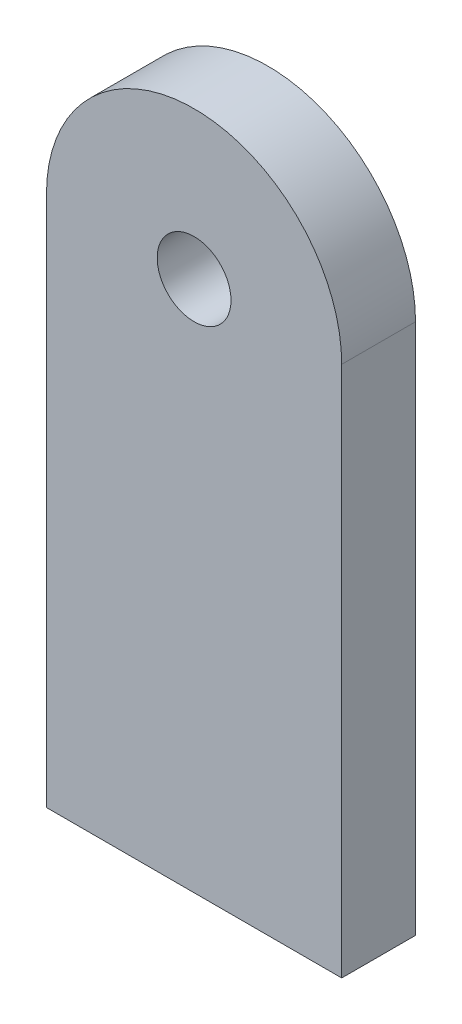
ISO-10303-21;
HEADER;
FILE_DESCRIPTION(('STEP AP214'),'2;1');
FILE_NAME('part.step','',(''),(''),'','','');
FILE_SCHEMA(('AUTOMOTIVE_DESIGN { 1 0 10303 214 1 1 1 1 }'));
ENDSEC;
DATA;
#1=APPLICATION_CONTEXT('core data for automotive mechanical design processes');
#2=APPLICATION_PROTOCOL_DEFINITION('international standard','automotive_design',2000,#1);
#3=PRODUCT_CONTEXT('',#1,'mechanical');
#4=PRODUCT('Part','Part','',(#3));
#5=PRODUCT_RELATED_PRODUCT_CATEGORY('part','',(#4));
#6=PRODUCT_DEFINITION_FORMATION('','',#4);
#7=PRODUCT_DEFINITION_CONTEXT('part definition',#1,'design');
#8=PRODUCT_DEFINITION('design','',#6,#7);
#9=PRODUCT_DEFINITION_SHAPE('','',#8);
#10=(LENGTH_UNIT() NAMED_UNIT(*) SI_UNIT(.MILLI.,.METRE.));
#11=(NAMED_UNIT(*) PLANE_ANGLE_UNIT() SI_UNIT($,.RADIAN.));
#12=(NAMED_UNIT(*) SI_UNIT($,.STERADIAN.) SOLID_ANGLE_UNIT());
#13=UNCERTAINTY_MEASURE_WITH_UNIT(LENGTH_MEASURE(1.E-05),#10,'distance_accuracy_value','');
#14=(GEOMETRIC_REPRESENTATION_CONTEXT(3) GLOBAL_UNCERTAINTY_ASSIGNED_CONTEXT((#13)) GLOBAL_UNIT_ASSIGNED_CONTEXT((#10,
#11,#12)) REPRESENTATION_CONTEXT('',''));
#15=CARTESIAN_POINT('',(0.,0.,0.));
#16=DIRECTION('',(0.,0.,1.));
#17=DIRECTION('',(1.,0.,0.));
#18=AXIS2_PLACEMENT_3D('',#15,#16,#17);
#19=CARTESIAN_POINT('',(50.,180.,25.));
#20=DIRECTION('',(0.,0.,-1.));
#21=DIRECTION('',(-1.,0.,0.));
#22=AXIS2_PLACEMENT_3D('',#19,#20,#21);
#23=PLANE('',#22);
#24=DIRECTION('',(0.,-1.,0.));
#25=VECTOR('',#24,1.);
#26=CARTESIAN_POINT('',(0.,180.,25.));
#27=LINE('',#26,#25);
#28=CARTESIAN_POINT('',(0.,180.,25.));
#29=VERTEX_POINT('',#28);
#30=CARTESIAN_POINT('',(0.,0.,25.));
#31=VERTEX_POINT('',#30);
#32=EDGE_CURVE('E88',#29,#31,#27,.T.);
#33=ORIENTED_EDGE('',*,*,#32,.T.);
#34=DIRECTION('',(1.,0.,0.));
#35=VECTOR('',#34,1.);
#36=CARTESIAN_POINT('',(0.,0.,25.));
#37=LINE('',#36,#35);
#38=CARTESIAN_POINT('',(100.,0.,25.));
#39=VERTEX_POINT('',#38);
#40=EDGE_CURVE('E83',#31,#39,#37,.T.);
#41=ORIENTED_EDGE('',*,*,#40,.T.);
#42=DIRECTION('',(0.,1.,0.));
#43=VECTOR('',#42,1.);
#44=CARTESIAN_POINT('',(100.,0.,25.));
#45=LINE('',#44,#43);
#46=CARTESIAN_POINT('',(100.,180.,25.));
#47=VERTEX_POINT('',#46);
#48=EDGE_CURVE('E86',#39,#47,#45,.T.);
#49=ORIENTED_EDGE('',*,*,#48,.T.);
#50=CARTESIAN_POINT('',(50.,180.,25.));
#51=DIRECTION('',(0.,0.,1.));
#52=DIRECTION('',(-1.,0.,0.));
#53=AXIS2_PLACEMENT_3D('',#50,#51,#52);
#54=CIRCLE('',#53,50.);
#55=EDGE_CURVE('E53',#47,#29,#54,.T.);
#56=ORIENTED_EDGE('',*,*,#55,.T.);
#57=EDGE_LOOP('',(#33,#41,#49,#56));
#58=FACE_BOUND('',#57,.T.);
#59=CARTESIAN_POINT('',(50.,180.,25.));
#60=DIRECTION('',(0.,0.,1.));
#61=DIRECTION('',(1.,0.,0.));
#62=AXIS2_PLACEMENT_3D('',#59,#60,#61);
#63=CIRCLE('',#62,12.5);
#64=CARTESIAN_POINT('',(62.5,180.,25.));
#65=VERTEX_POINT('',#64);
#66=EDGE_CURVE('E103',#65,#65,#63,.T.);
#67=ORIENTED_EDGE('',*,*,#66,.F.);
#68=EDGE_LOOP('',(#67));
#69=FACE_BOUND('',#68,.T.);
#70=ADVANCED_FACE('F36',(#58,#69),#23,.F.);
#71=CARTESIAN_POINT('',(50.,180.,0.));
#72=DIRECTION('',(0.,0.,-1.));
#73=DIRECTION('',(-1.,0.,0.));
#74=AXIS2_PLACEMENT_3D('',#71,#72,#73);
#75=PLANE('',#74);
#76=DIRECTION('',(0.,-1.,0.));
#77=VECTOR('',#76,1.);
#78=CARTESIAN_POINT('',(0.,180.,0.));
#79=LINE('',#78,#77);
#80=CARTESIAN_POINT('',(0.,180.,0.));
#81=VERTEX_POINT('',#80);
#82=CARTESIAN_POINT('',(0.,0.,0.));
#83=VERTEX_POINT('',#82);
#84=EDGE_CURVE('E100',#81,#83,#79,.T.);
#85=ORIENTED_EDGE('',*,*,#84,.F.);
#86=CARTESIAN_POINT('',(50.,180.,0.));
#87=DIRECTION('',(0.,0.,1.));
#88=DIRECTION('',(-1.,0.,0.));
#89=AXIS2_PLACEMENT_3D('',#86,#87,#88);
#90=CIRCLE('',#89,50.);
#91=CARTESIAN_POINT('',(100.,180.,0.));
#92=VERTEX_POINT('',#91);
#93=EDGE_CURVE('E76',#92,#81,#90,.T.);
#94=ORIENTED_EDGE('',*,*,#93,.F.);
#95=DIRECTION('',(0.,1.,0.));
#96=VECTOR('',#95,1.);
#97=CARTESIAN_POINT('',(100.,0.,0.));
#98=LINE('',#97,#96);
#99=CARTESIAN_POINT('',(100.,0.,0.));
#100=VERTEX_POINT('',#99);
#101=EDGE_CURVE('E70',#100,#92,#98,.T.);
#102=ORIENTED_EDGE('',*,*,#101,.F.);
#103=DIRECTION('',(1.,0.,0.));
#104=VECTOR('',#103,1.);
#105=CARTESIAN_POINT('',(0.,0.,0.));
#106=LINE('',#105,#104);
#107=EDGE_CURVE('E92',#83,#100,#106,.T.);
#108=ORIENTED_EDGE('',*,*,#107,.F.);
#109=EDGE_LOOP('',(#85,#94,#102,#108));
#110=FACE_BOUND('',#109,.T.);
#111=CARTESIAN_POINT('',(50.,180.,0.));
#112=DIRECTION('',(0.,0.,1.));
#113=DIRECTION('',(1.,0.,0.));
#114=AXIS2_PLACEMENT_3D('',#111,#112,#113);
#115=CIRCLE('',#114,12.5);
#116=CARTESIAN_POINT('',(62.5,180.,0.));
#117=VERTEX_POINT('',#116);
#118=EDGE_CURVE('E115',#117,#117,#115,.T.);
#119=ORIENTED_EDGE('',*,*,#118,.T.);
#120=EDGE_LOOP('',(#119));
#121=FACE_BOUND('',#120,.T.);
#122=ADVANCED_FACE('F111',(#110,#121),#75,.T.);
#123=CARTESIAN_POINT('',(0.,180.,25.));
#124=DIRECTION('',(1.,0.,0.));
#125=DIRECTION('',(0.,1.,0.));
#126=AXIS2_PLACEMENT_3D('',#123,#124,#125);
#127=PLANE('',#126);
#128=ORIENTED_EDGE('',*,*,#84,.T.);
#129=DIRECTION('',(0.,0.,-1.));
#130=VECTOR('',#129,1.);
#131=CARTESIAN_POINT('',(0.,0.,25.));
#132=LINE('',#131,#130);
#133=EDGE_CURVE('E11',#31,#83,#132,.T.);
#134=ORIENTED_EDGE('',*,*,#133,.F.);
#135=ORIENTED_EDGE('',*,*,#32,.F.);
#136=DIRECTION('',(0.,0.,-1.));
#137=VECTOR('',#136,1.);
#138=CARTESIAN_POINT('',(0.,180.,25.));
#139=LINE('',#138,#137);
#140=EDGE_CURVE('E96',#29,#81,#139,.T.);
#141=ORIENTED_EDGE('',*,*,#140,.T.);
#142=EDGE_LOOP('',(#128,#134,#135,#141));
#143=FACE_BOUND('',#142,.T.);
#144=ADVANCED_FACE('F38',(#143),#127,.F.);
#145=CARTESIAN_POINT('',(0.,0.,25.));
#146=DIRECTION('',(0.,1.,0.));
#147=DIRECTION('',(0.,0.,1.));
#148=AXIS2_PLACEMENT_3D('',#145,#146,#147);
#149=PLANE('',#148);
#150=ORIENTED_EDGE('',*,*,#107,.T.);
#151=DIRECTION('',(0.,0.,-1.));
#152=VECTOR('',#151,1.);
#153=CARTESIAN_POINT('',(100.,0.,25.));
#154=LINE('',#153,#152);
#155=EDGE_CURVE('E45',#39,#100,#154,.T.);
#156=ORIENTED_EDGE('',*,*,#155,.F.);
#157=ORIENTED_EDGE('',*,*,#40,.F.);
#158=ORIENTED_EDGE('',*,*,#133,.T.);
#159=EDGE_LOOP('',(#150,#156,#157,#158));
#160=FACE_BOUND('',#159,.T.);
#161=ADVANCED_FACE('F91',(#160),#149,.F.);
#162=CARTESIAN_POINT('',(100.,0.,25.));
#163=DIRECTION('',(-1.,0.,0.));
#164=DIRECTION('',(0.,0.,1.));
#165=AXIS2_PLACEMENT_3D('',#162,#163,#164);
#166=PLANE('',#165);
#167=ORIENTED_EDGE('',*,*,#101,.T.);
#168=DIRECTION('',(0.,0.,-1.));
#169=VECTOR('',#168,1.);
#170=CARTESIAN_POINT('',(100.,180.,25.));
#171=LINE('',#170,#169);
#172=EDGE_CURVE('E93',#47,#92,#171,.T.);
#173=ORIENTED_EDGE('',*,*,#172,.F.);
#174=ORIENTED_EDGE('',*,*,#48,.F.);
#175=ORIENTED_EDGE('',*,*,#155,.T.);
#176=EDGE_LOOP('',(#167,#173,#174,#175));
#177=FACE_BOUND('',#176,.T.);
#178=ADVANCED_FACE('F94',(#177),#166,.F.);
#179=CARTESIAN_POINT('',(50.,180.,25.));
#180=DIRECTION('',(0.,0.,-1.));
#181=DIRECTION('',(-1.,0.,0.));
#182=AXIS2_PLACEMENT_3D('',#179,#180,#181);
#183=CYLINDRICAL_SURFACE('',#182,50.);
#184=ORIENTED_EDGE('',*,*,#93,.T.);
#185=ORIENTED_EDGE('',*,*,#140,.F.);
#186=ORIENTED_EDGE('',*,*,#55,.F.);
#187=ORIENTED_EDGE('',*,*,#172,.T.);
#188=EDGE_LOOP('',(#184,#185,#186,#187));
#189=FACE_BOUND('',#188,.T.);
#190=ADVANCED_FACE('F108',(#189),#183,.T.);
#191=CARTESIAN_POINT('',(50.,180.,25.));
#192=DIRECTION('',(0.,0.,-1.));
#193=DIRECTION('',(-1.,0.,0.));
#194=AXIS2_PLACEMENT_3D('',#191,#192,#193);
#195=CYLINDRICAL_SURFACE('',#194,12.5);
#196=ORIENTED_EDGE('',*,*,#66,.T.);
#197=EDGE_LOOP('',(#196));
#198=FACE_BOUND('',#197,.T.);
#199=ORIENTED_EDGE('',*,*,#118,.F.);
#200=EDGE_LOOP('',(#199));
#201=FACE_BOUND('',#200,.T.);
#202=ADVANCED_FACE('F121',(#198,#201),#195,.F.);
#203=CLOSED_SHELL('',(#70,#122,#144,#161,#178,#190,#202));
#204=MANIFOLD_SOLID_BREP('B2',#203);
#205=ADVANCED_BREP_SHAPE_REPRESENTATION('',(#18,#204),#14);
#206=SHAPE_DEFINITION_REPRESENTATION(#9,#205);
ENDSEC;
END-ISO-10303-21;
